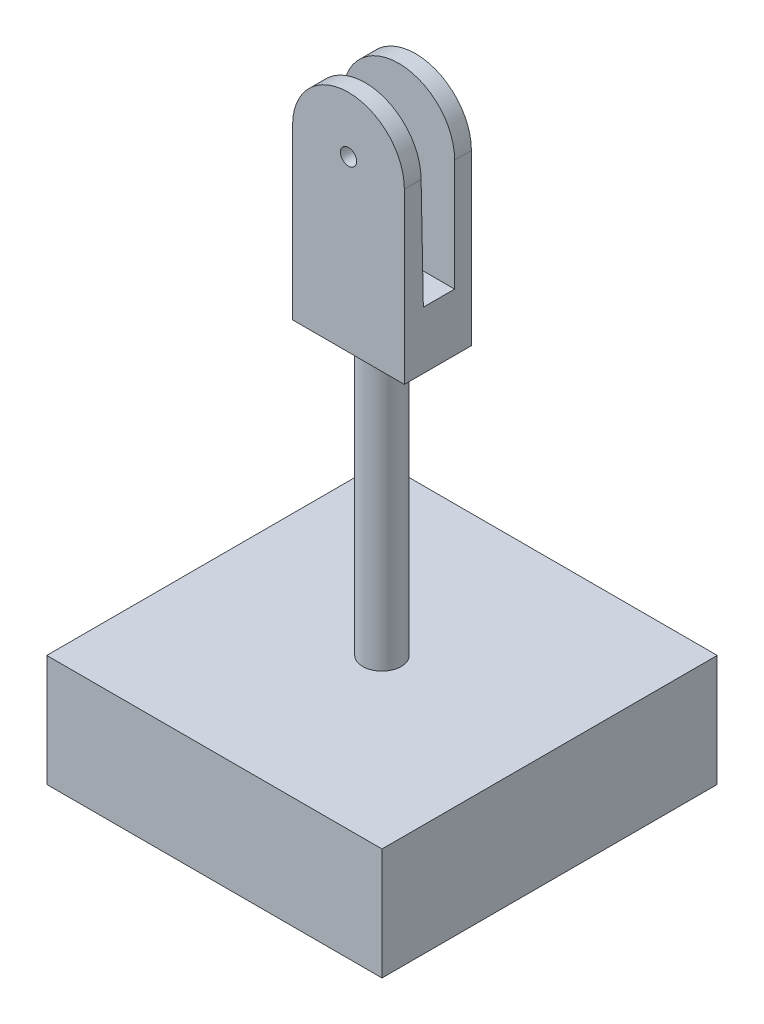
ISO-10303-21;
HEADER;
FILE_DESCRIPTION(('STEP AP214'),'2;1');
FILE_NAME('part.step','',(''),(''),'','','');
FILE_SCHEMA(('AUTOMOTIVE_DESIGN { 1 0 10303 214 1 1 1 1 }'));
ENDSEC;
DATA;
#1=APPLICATION_CONTEXT('core data for automotive mechanical design processes');
#2=APPLICATION_PROTOCOL_DEFINITION('international standard','automotive_design',2000,#1);
#3=PRODUCT_CONTEXT('',#1,'mechanical');
#4=PRODUCT('Part','Part','',(#3));
#5=PRODUCT_RELATED_PRODUCT_CATEGORY('part','',(#4));
#6=PRODUCT_DEFINITION_FORMATION('','',#4);
#7=PRODUCT_DEFINITION_CONTEXT('part definition',#1,'design');
#8=PRODUCT_DEFINITION('design','',#6,#7);
#9=PRODUCT_DEFINITION_SHAPE('','',#8);
#10=(LENGTH_UNIT() NAMED_UNIT(*) SI_UNIT(.MILLI.,.METRE.));
#11=(NAMED_UNIT(*) PLANE_ANGLE_UNIT() SI_UNIT($,.RADIAN.));
#12=(NAMED_UNIT(*) SI_UNIT($,.STERADIAN.) SOLID_ANGLE_UNIT());
#13=UNCERTAINTY_MEASURE_WITH_UNIT(LENGTH_MEASURE(1.E-05),#10,'distance_accuracy_value','');
#14=(GEOMETRIC_REPRESENTATION_CONTEXT(3) GLOBAL_UNCERTAINTY_ASSIGNED_CONTEXT((#13)) GLOBAL_UNIT_ASSIGNED_CONTEXT((#10,
#11,#12)) REPRESENTATION_CONTEXT('',''));
#15=CARTESIAN_POINT('',(0.,0.,0.));
#16=DIRECTION('',(0.,0.,1.));
#17=DIRECTION('',(1.,0.,0.));
#18=AXIS2_PLACEMENT_3D('',#15,#16,#17);
#19=CARTESIAN_POINT('',(0.,-100.276417548068,36.));
#20=DIRECTION('',(0.,0.,-1.));
#21=DIRECTION('',(-1.,0.,0.));
#22=AXIS2_PLACEMENT_3D('',#19,#20,#21);
#23=PLANE('',#22);
#24=DIRECTION('',(-1.,0.,0.));
#25=VECTOR('',#24,1.);
#26=CARTESIAN_POINT('',(0.,-80.2764175480678,36.));
#27=LINE('',#26,#25);
#28=CARTESIAN_POINT('',(30.,-80.2764175480678,36.));
#29=VERTEX_POINT('',#28);
#30=CARTESIAN_POINT('',(-30.,-80.2764175480678,36.));
#31=VERTEX_POINT('',#30);
#32=EDGE_CURVE('E113',#29,#31,#27,.T.);
#33=ORIENTED_EDGE('',*,*,#32,.T.);
#34=DIRECTION('',(0.,1.,0.));
#35=VECTOR('',#34,1.);
#36=CARTESIAN_POINT('',(-30.,-100.276417548068,36.));
#37=LINE('',#36,#35);
#38=CARTESIAN_POINT('',(-30.,-100.276417548068,36.));
#39=VERTEX_POINT('',#38);
#40=EDGE_CURVE('E12',#39,#31,#37,.T.);
#41=ORIENTED_EDGE('',*,*,#40,.F.);
#42=DIRECTION('',(-1.,0.,0.));
#43=VECTOR('',#42,1.);
#44=CARTESIAN_POINT('',(0.,-100.276417548068,36.));
#45=LINE('',#44,#43);
#46=CARTESIAN_POINT('',(30.,-100.276417548068,36.));
#47=VERTEX_POINT('',#46);
#48=EDGE_CURVE('E96',#47,#39,#45,.T.);
#49=ORIENTED_EDGE('',*,*,#48,.F.);
#50=DIRECTION('',(0.,1.,0.));
#51=VECTOR('',#50,1.);
#52=CARTESIAN_POINT('',(30.,-100.276417548068,36.));
#53=LINE('',#52,#51);
#54=EDGE_CURVE('E63',#47,#29,#53,.T.);
#55=ORIENTED_EDGE('',*,*,#54,.T.);
#56=EDGE_LOOP('',(#33,#41,#49,#55));
#57=FACE_BOUND('',#56,.T.);
#58=ADVANCED_FACE('F46',(#57),#23,.F.);
#59=CARTESIAN_POINT('',(-30.,-100.276417548068,0.));
#60=DIRECTION('',(1.,0.,0.));
#61=DIRECTION('',(0.,0.,-1.));
#62=AXIS2_PLACEMENT_3D('',#59,#60,#61);
#63=PLANE('',#62);
#64=DIRECTION('',(0.,0.,-1.));
#65=VECTOR('',#64,1.);
#66=CARTESIAN_POINT('',(-30.,-80.2764175480678,0.));
#67=LINE('',#66,#65);
#68=CARTESIAN_POINT('',(-30.,-80.2764175480678,-24.));
#69=VERTEX_POINT('',#68);
#70=EDGE_CURVE('E101',#31,#69,#67,.T.);
#71=ORIENTED_EDGE('',*,*,#70,.T.);
#72=DIRECTION('',(0.,1.,0.));
#73=VECTOR('',#72,1.);
#74=CARTESIAN_POINT('',(-30.,-100.276417548068,-24.));
#75=LINE('',#74,#73);
#76=CARTESIAN_POINT('',(-30.,-100.276417548068,-24.));
#77=VERTEX_POINT('',#76);
#78=EDGE_CURVE('E55',#77,#69,#75,.T.);
#79=ORIENTED_EDGE('',*,*,#78,.F.);
#80=DIRECTION('',(0.,0.,-1.));
#81=VECTOR('',#80,1.);
#82=CARTESIAN_POINT('',(-30.,-100.276417548068,0.));
#83=LINE('',#82,#81);
#84=EDGE_CURVE('E88',#39,#77,#83,.T.);
#85=ORIENTED_EDGE('',*,*,#84,.F.);
#86=ORIENTED_EDGE('',*,*,#40,.T.);
#87=EDGE_LOOP('',(#71,#79,#85,#86));
#88=FACE_BOUND('',#87,.T.);
#89=ADVANCED_FACE('F100',(#88),#63,.F.);
#90=CARTESIAN_POINT('',(0.,-100.276417548068,-24.));
#91=DIRECTION('',(0.,0.,-1.));
#92=DIRECTION('',(-1.,0.,0.));
#93=AXIS2_PLACEMENT_3D('',#90,#91,#92);
#94=PLANE('',#93);
#95=DIRECTION('',(-1.,0.,0.));
#96=VECTOR('',#95,1.);
#97=CARTESIAN_POINT('',(0.,-80.2764175480678,-24.));
#98=LINE('',#97,#96);
#99=CARTESIAN_POINT('',(30.,-80.2764175480678,-24.));
#100=VERTEX_POINT('',#99);
#101=EDGE_CURVE('E116',#100,#69,#98,.T.);
#102=ORIENTED_EDGE('',*,*,#101,.F.);
#103=DIRECTION('',(0.,1.,0.));
#104=VECTOR('',#103,1.);
#105=CARTESIAN_POINT('',(30.,-100.276417548068,-24.));
#106=LINE('',#105,#104);
#107=CARTESIAN_POINT('',(30.,-100.276417548068,-24.));
#108=VERTEX_POINT('',#107);
#109=EDGE_CURVE('E77',#108,#100,#106,.T.);
#110=ORIENTED_EDGE('',*,*,#109,.F.);
#111=DIRECTION('',(-1.,0.,0.));
#112=VECTOR('',#111,1.);
#113=CARTESIAN_POINT('',(0.,-100.276417548068,-24.));
#114=LINE('',#113,#112);
#115=EDGE_CURVE('E95',#108,#77,#114,.T.);
#116=ORIENTED_EDGE('',*,*,#115,.T.);
#117=ORIENTED_EDGE('',*,*,#78,.T.);
#118=EDGE_LOOP('',(#102,#110,#116,#117));
#119=FACE_BOUND('',#118,.T.);
#120=ADVANCED_FACE('F104',(#119),#94,.T.);
#121=CARTESIAN_POINT('',(0.,-100.276417548068,6.));
#122=DIRECTION('',(0.,1.,0.));
#123=DIRECTION('',(0.,0.,1.));
#124=AXIS2_PLACEMENT_3D('',#121,#122,#123);
#125=CYLINDRICAL_SURFACE('',#124,3.45);
#126=CARTESIAN_POINT('',(0.,-100.276417548068,6.));
#127=DIRECTION('',(0.,-1.,0.));
#128=DIRECTION('',(0.,0.,-1.));
#129=AXIS2_PLACEMENT_3D('',#126,#127,#128);
#130=CIRCLE('',#129,3.45);
#131=CARTESIAN_POINT('',(0.,-100.276417548068,2.55));
#132=VERTEX_POINT('',#131);
#133=EDGE_CURVE('E121',#132,#132,#130,.T.);
#134=ORIENTED_EDGE('',*,*,#133,.T.);
#135=EDGE_LOOP('',(#134));
#136=FACE_BOUND('',#135,.T.);
#137=CARTESIAN_POINT('',(0.,-80.2764175480678,6.));
#138=DIRECTION('',(0.,-1.,0.));
#139=DIRECTION('',(0.,0.,-1.));
#140=AXIS2_PLACEMENT_3D('',#137,#138,#139);
#141=CIRCLE('',#140,3.45);
#142=CARTESIAN_POINT('',(0.,-80.2764175480678,2.55));
#143=VERTEX_POINT('',#142);
#144=EDGE_CURVE('E110',#143,#143,#141,.T.);
#145=ORIENTED_EDGE('',*,*,#144,.F.);
#146=EDGE_LOOP('',(#145));
#147=FACE_BOUND('',#146,.T.);
#148=ADVANCED_FACE('F48',(#136,#147),#125,.F.);
#149=CARTESIAN_POINT('',(30.,-100.276417548068,0.));
#150=DIRECTION('',(1.,0.,0.));
#151=DIRECTION('',(0.,0.,-1.));
#152=AXIS2_PLACEMENT_3D('',#149,#150,#151);
#153=PLANE('',#152);
#154=DIRECTION('',(0.,0.,-1.));
#155=VECTOR('',#154,1.);
#156=CARTESIAN_POINT('',(30.,-80.2764175480678,0.));
#157=LINE('',#156,#155);
#158=EDGE_CURVE('E118',#29,#100,#157,.T.);
#159=ORIENTED_EDGE('',*,*,#158,.F.);
#160=ORIENTED_EDGE('',*,*,#54,.F.);
#161=DIRECTION('',(0.,0.,-1.));
#162=VECTOR('',#161,1.);
#163=CARTESIAN_POINT('',(30.,-100.276417548068,0.));
#164=LINE('',#163,#162);
#165=EDGE_CURVE('E105',#47,#108,#164,.T.);
#166=ORIENTED_EDGE('',*,*,#165,.T.);
#167=ORIENTED_EDGE('',*,*,#109,.T.);
#168=EDGE_LOOP('',(#159,#160,#166,#167));
#169=FACE_BOUND('',#168,.T.);
#170=ADVANCED_FACE('F132',(#169),#153,.T.);
#171=CARTESIAN_POINT('',(0.,-100.276417548068,0.));
#172=DIRECTION('',(0.,-1.,0.));
#173=DIRECTION('',(0.,0.,-1.));
#174=AXIS2_PLACEMENT_3D('',#171,#172,#173);
#175=PLANE('',#174);
#176=ORIENTED_EDGE('',*,*,#133,.F.);
#177=EDGE_LOOP('',(#176));
#178=FACE_BOUND('',#177,.T.);
#179=ORIENTED_EDGE('',*,*,#48,.T.);
#180=ORIENTED_EDGE('',*,*,#84,.T.);
#181=ORIENTED_EDGE('',*,*,#115,.F.);
#182=ORIENTED_EDGE('',*,*,#165,.F.);
#183=EDGE_LOOP('',(#179,#180,#181,#182));
#184=FACE_BOUND('',#183,.T.);
#185=ADVANCED_FACE('F92',(#178,#184),#175,.T.);
#186=CARTESIAN_POINT('',(0.,-80.2764175480678,0.));
#187=DIRECTION('',(0.,-1.,0.));
#188=DIRECTION('',(0.,0.,-1.));
#189=AXIS2_PLACEMENT_3D('',#186,#187,#188);
#190=PLANE('',#189);
#191=ORIENTED_EDGE('',*,*,#144,.T.);
#192=EDGE_LOOP('',(#191));
#193=FACE_BOUND('',#192,.T.);
#194=ORIENTED_EDGE('',*,*,#32,.F.);
#195=ORIENTED_EDGE('',*,*,#158,.T.);
#196=ORIENTED_EDGE('',*,*,#101,.T.);
#197=ORIENTED_EDGE('',*,*,#70,.F.);
#198=EDGE_LOOP('',(#194,#195,#196,#197));
#199=FACE_BOUND('',#198,.T.);
#200=ADVANCED_FACE('F131',(#193,#199),#190,.F.);
#201=CLOSED_SHELL('',(#58,#89,#120,#148,#170,#185,#200));
#202=MANIFOLD_SOLID_BREP('B2',#201);
#203=CARTESIAN_POINT('',(10.,0.,12.));
#204=DIRECTION('',(-1.,0.,0.));
#205=DIRECTION('',(0.,-1.,0.));
#206=AXIS2_PLACEMENT_3D('',#203,#204,#205);
#207=PLANE('',#206);
#208=DIRECTION('',(0.,-1.,0.));
#209=VECTOR('',#208,1.);
#210=CARTESIAN_POINT('',(10.,0.,3.));
#211=LINE('',#210,#209);
#212=CARTESIAN_POINT('',(10.,0.,3.));
#213=VERTEX_POINT('',#212);
#214=CARTESIAN_POINT('',(10.,-20.,3.));
#215=VERTEX_POINT('',#214);
#216=EDGE_CURVE('E354',#213,#215,#211,.T.);
#217=ORIENTED_EDGE('',*,*,#216,.T.);
#218=DIRECTION('',(0.,0.,-1.));
#219=VECTOR('',#218,1.);
#220=CARTESIAN_POINT('',(10.,-20.,0.));
#221=LINE('',#220,#219);
#222=CARTESIAN_POINT('',(10.,-20.,8.60053372982809));
#223=VERTEX_POINT('',#222);
#224=EDGE_CURVE('E393',#223,#215,#221,.T.);
#225=ORIENTED_EDGE('',*,*,#224,.F.);
#226=DIRECTION('',(0.,-0.999800593034313,-0.0199693306907542));
#227=VECTOR('',#226,1.);
#228=CARTESIAN_POINT('',(10.,-0.179688138004029,8.99641103248587));
#229=LINE('',#228,#227);
#230=CARTESIAN_POINT('',(10.,0.,9.));
#231=VERTEX_POINT('',#230);
#232=EDGE_CURVE('E391',#231,#223,#229,.T.);
#233=ORIENTED_EDGE('',*,*,#232,.F.);
#234=DIRECTION('',(0.,0.,-1.));
#235=VECTOR('',#234,1.);
#236=CARTESIAN_POINT('',(10.,0.,12.));
#237=LINE('',#236,#235);
#238=CARTESIAN_POINT('',(10.,0.,12.));
#239=VERTEX_POINT('',#238);
#240=EDGE_CURVE('E288',#239,#231,#237,.T.);
#241=ORIENTED_EDGE('',*,*,#240,.F.);
#242=DIRECTION('',(0.,1.,0.));
#243=VECTOR('',#242,1.);
#244=CARTESIAN_POINT('',(10.,0.,12.));
#245=LINE('',#244,#243);
#246=CARTESIAN_POINT('',(10.,-30.2764175480678,12.));
#247=VERTEX_POINT('',#246);
#248=EDGE_CURVE('E313',#247,#239,#245,.T.);
#249=ORIENTED_EDGE('',*,*,#248,.F.);
#250=DIRECTION('',(0.,0.,-1.));
#251=VECTOR('',#250,1.);
#252=CARTESIAN_POINT('',(10.,-30.2764175480678,12.));
#253=LINE('',#252,#251);
#254=CARTESIAN_POINT('',(10.,-30.2764175480678,0.));
#255=VERTEX_POINT('',#254);
#256=EDGE_CURVE('E328',#247,#255,#253,.T.);
#257=ORIENTED_EDGE('',*,*,#256,.T.);
#258=DIRECTION('',(0.,1.,0.));
#259=VECTOR('',#258,1.);
#260=CARTESIAN_POINT('',(10.,0.,0.));
#261=LINE('',#260,#259);
#262=CARTESIAN_POINT('',(10.,0.,0.));
#263=VERTEX_POINT('',#262);
#264=EDGE_CURVE('E332',#255,#263,#261,.T.);
#265=ORIENTED_EDGE('',*,*,#264,.T.);
#266=EDGE_CURVE('E295',#213,#263,#237,.T.);
#267=ORIENTED_EDGE('',*,*,#266,.F.);
#268=EDGE_LOOP('',(#217,#225,#233,#241,#249,#257,#265,#267));
#269=FACE_BOUND('',#268,.T.);
#270=ADVANCED_FACE('F190',(#269),#207,.F.);
#271=CARTESIAN_POINT('',(0.,0.,12.));
#272=DIRECTION('',(0.,0.,-1.));
#273=DIRECTION('',(-1.,0.,0.));
#274=AXIS2_PLACEMENT_3D('',#271,#272,#273);
#275=CYLINDRICAL_SURFACE('',#274,10.);
#276=CARTESIAN_POINT('',(0.,0.,3.));
#277=DIRECTION('',(0.,0.,1.));
#278=DIRECTION('',(1.,0.,0.));
#279=AXIS2_PLACEMENT_3D('',#276,#277,#278);
#280=CIRCLE('',#279,10.);
#281=CARTESIAN_POINT('',(-10.,0.,3.));
#282=VERTEX_POINT('',#281);
#283=EDGE_CURVE('E322',#213,#282,#280,.T.);
#284=ORIENTED_EDGE('',*,*,#283,.F.);
#285=ORIENTED_EDGE('',*,*,#266,.T.);
#286=CARTESIAN_POINT('',(0.,0.,0.));
#287=DIRECTION('',(0.,0.,1.));
#288=DIRECTION('',(1.,0.,0.));
#289=AXIS2_PLACEMENT_3D('',#286,#287,#288);
#290=CIRCLE('',#289,10.);
#291=CARTESIAN_POINT('',(-10.,0.,0.));
#292=VERTEX_POINT('',#291);
#293=EDGE_CURVE('E335',#263,#292,#290,.T.);
#294=ORIENTED_EDGE('',*,*,#293,.T.);
#295=DIRECTION('',(0.,0.,-1.));
#296=VECTOR('',#295,1.);
#297=CARTESIAN_POINT('',(-10.,0.,12.));
#298=LINE('',#297,#296);
#299=EDGE_CURVE('E296',#282,#292,#298,.T.);
#300=ORIENTED_EDGE('',*,*,#299,.F.);
#301=EDGE_LOOP('',(#284,#285,#294,#300));
#302=FACE_BOUND('',#301,.T.);
#303=ADVANCED_FACE('F357',(#302),#275,.T.);
#304=CARTESIAN_POINT('',(0.,0.,9.));
#305=DIRECTION('',(0.,0.,-1.));
#306=DIRECTION('',(-1.,0.,0.));
#307=AXIS2_PLACEMENT_3D('',#304,#305,#306);
#308=CIRCLE('',#307,10.);
#309=CARTESIAN_POINT('',(-10.,0.,9.));
#310=VERTEX_POINT('',#309);
#311=EDGE_CURVE('E266',#310,#231,#308,.T.);
#312=ORIENTED_EDGE('',*,*,#311,.F.);
#313=CARTESIAN_POINT('',(-10.,0.,12.));
#314=VERTEX_POINT('',#313);
#315=EDGE_CURVE('E285',#314,#310,#298,.T.);
#316=ORIENTED_EDGE('',*,*,#315,.F.);
#317=CARTESIAN_POINT('',(0.,0.,12.));
#318=DIRECTION('',(0.,0.,1.));
#319=DIRECTION('',(1.,0.,0.));
#320=AXIS2_PLACEMENT_3D('',#317,#318,#319);
#321=CIRCLE('',#320,10.);
#322=EDGE_CURVE('E317',#239,#314,#321,.T.);
#323=ORIENTED_EDGE('',*,*,#322,.F.);
#324=ORIENTED_EDGE('',*,*,#240,.T.);
#325=EDGE_LOOP('',(#312,#316,#323,#324));
#326=FACE_BOUND('',#325,.T.);
#327=ADVANCED_FACE('F284',(#326),#275,.T.);
#328=CARTESIAN_POINT('',(-10.,0.,12.));
#329=DIRECTION('',(1.,0.,0.));
#330=DIRECTION('',(0.,1.,0.));
#331=AXIS2_PLACEMENT_3D('',#328,#329,#330);
#332=PLANE('',#331);
#333=DIRECTION('',(0.,-1.,0.));
#334=VECTOR('',#333,1.);
#335=CARTESIAN_POINT('',(-10.,0.,3.));
#336=LINE('',#335,#334);
#337=CARTESIAN_POINT('',(-10.,-20.,3.));
#338=VERTEX_POINT('',#337);
#339=EDGE_CURVE('E279',#282,#338,#336,.T.);
#340=ORIENTED_EDGE('',*,*,#339,.F.);
#341=ORIENTED_EDGE('',*,*,#299,.T.);
#342=DIRECTION('',(0.,-1.,0.));
#343=VECTOR('',#342,1.);
#344=CARTESIAN_POINT('',(-10.,0.,0.));
#345=LINE('',#344,#343);
#346=CARTESIAN_POINT('',(-10.,-30.2764175480678,0.));
#347=VERTEX_POINT('',#346);
#348=EDGE_CURVE('E319',#292,#347,#345,.T.);
#349=ORIENTED_EDGE('',*,*,#348,.T.);
#350=DIRECTION('',(0.,0.,-1.));
#351=VECTOR('',#350,1.);
#352=CARTESIAN_POINT('',(-10.,-30.2764175480678,12.));
#353=LINE('',#352,#351);
#354=CARTESIAN_POINT('',(-10.,-30.2764175480678,12.));
#355=VERTEX_POINT('',#354);
#356=EDGE_CURVE('E299',#355,#347,#353,.T.);
#357=ORIENTED_EDGE('',*,*,#356,.F.);
#358=DIRECTION('',(0.,-1.,0.));
#359=VECTOR('',#358,1.);
#360=CARTESIAN_POINT('',(-10.,0.,12.));
#361=LINE('',#360,#359);
#362=EDGE_CURVE('E294',#314,#355,#361,.T.);
#363=ORIENTED_EDGE('',*,*,#362,.F.);
#364=ORIENTED_EDGE('',*,*,#315,.T.);
#365=DIRECTION('',(0.,-0.999800593034313,-0.0199693306907542));
#366=VECTOR('',#365,1.);
#367=CARTESIAN_POINT('',(-10.,-0.179688138004029,8.99641103248587));
#368=LINE('',#367,#366);
#369=CARTESIAN_POINT('',(-10.,-20.,8.60053372982809));
#370=VERTEX_POINT('',#369);
#371=EDGE_CURVE('E274',#310,#370,#368,.T.);
#372=ORIENTED_EDGE('',*,*,#371,.T.);
#373=DIRECTION('',(0.,0.,-1.));
#374=VECTOR('',#373,1.);
#375=CARTESIAN_POINT('',(-10.,-20.,0.));
#376=LINE('',#375,#374);
#377=EDGE_CURVE('E207',#370,#338,#376,.T.);
#378=ORIENTED_EDGE('',*,*,#377,.T.);
#379=EDGE_LOOP('',(#340,#341,#349,#357,#363,#364,#372,#378));
#380=FACE_BOUND('',#379,.T.);
#381=ADVANCED_FACE('F292',(#380),#332,.F.);
#382=CARTESIAN_POINT('',(0.,0.,12.));
#383=DIRECTION('',(0.,0.,-1.));
#384=DIRECTION('',(-1.,0.,0.));
#385=AXIS2_PLACEMENT_3D('',#382,#383,#384);
#386=CYLINDRICAL_SURFACE('',#385,1.45);
#387=CARTESIAN_POINT('',(0.,0.,0.));
#388=DIRECTION('',(0.,0.,1.));
#389=DIRECTION('',(1.,0.,0.));
#390=AXIS2_PLACEMENT_3D('',#387,#388,#389);
#391=CIRCLE('',#390,1.45);
#392=CARTESIAN_POINT('',(1.45,0.,0.));
#393=VERTEX_POINT('',#392);
#394=EDGE_CURVE('E329',#393,#393,#391,.T.);
#395=ORIENTED_EDGE('',*,*,#394,.F.);
#396=EDGE_LOOP('',(#395));
#397=FACE_BOUND('',#396,.T.);
#398=CARTESIAN_POINT('',(0.,0.,3.));
#399=DIRECTION('',(0.,0.,1.));
#400=DIRECTION('',(1.,0.,0.));
#401=AXIS2_PLACEMENT_3D('',#398,#399,#400);
#402=CIRCLE('',#401,1.45);
#403=CARTESIAN_POINT('',(1.45,0.,3.));
#404=VERTEX_POINT('',#403);
#405=EDGE_CURVE('E194',#404,#404,#402,.T.);
#406=ORIENTED_EDGE('',*,*,#405,.T.);
#407=EDGE_LOOP('',(#406));
#408=FACE_BOUND('',#407,.T.);
#409=ADVANCED_FACE('F308',(#397,#408),#386,.F.);
#410=CARTESIAN_POINT('',(0.,0.,9.));
#411=DIRECTION('',(0.,-0.0199693306907542,0.999800593034313));
#412=DIRECTION('',(0.,-0.999800593034313,-0.0199693306907542));
#413=AXIS2_PLACEMENT_3D('',#410,#411,#412);
#414=ELLIPSE('',#413,1.4502891977683,1.45);
#415=CARTESIAN_POINT('',(-1.45,0.,9.));
#416=VERTEX_POINT('',#415);
#417=CARTESIAN_POINT('',(1.45,0.,9.));
#418=VERTEX_POINT('',#417);
#419=EDGE_CURVE('E199',#416,#418,#414,.T.);
#420=ORIENTED_EDGE('',*,*,#419,.F.);
#421=CARTESIAN_POINT('',(0.,0.,9.));
#422=DIRECTION('',(0.,0.,-1.));
#423=DIRECTION('',(-1.,0.,0.));
#424=AXIS2_PLACEMENT_3D('',#421,#422,#423);
#425=CIRCLE('',#424,1.45);
#426=EDGE_CURVE('E268',#416,#418,#425,.T.);
#427=ORIENTED_EDGE('',*,*,#426,.T.);
#428=EDGE_LOOP('',(#420,#427));
#429=FACE_BOUND('',#428,.T.);
#430=CARTESIAN_POINT('',(0.,0.,12.));
#431=DIRECTION('',(0.,0.,1.));
#432=DIRECTION('',(1.,0.,0.));
#433=AXIS2_PLACEMENT_3D('',#430,#431,#432);
#434=CIRCLE('',#433,1.45);
#435=CARTESIAN_POINT('',(1.45,0.,12.));
#436=VERTEX_POINT('',#435);
#437=EDGE_CURVE('E311',#436,#436,#434,.T.);
#438=ORIENTED_EDGE('',*,*,#437,.T.);
#439=EDGE_LOOP('',(#438));
#440=FACE_BOUND('',#439,.T.);
#441=ADVANCED_FACE('F192',(#429,#440),#386,.F.);
#442=CARTESIAN_POINT('',(0.,-30.2764175480678,12.));
#443=DIRECTION('',(0.,1.,0.));
#444=DIRECTION('',(0.,0.,1.));
#445=AXIS2_PLACEMENT_3D('',#442,#443,#444);
#446=PLANE('',#445);
#447=CARTESIAN_POINT('',(0.,-30.2764175480678,6.));
#448=DIRECTION('',(0.,-1.,0.));
#449=DIRECTION('',(0.,0.,-1.));
#450=AXIS2_PLACEMENT_3D('',#447,#448,#449);
#451=CIRCLE('',#450,3.45);
#452=CARTESIAN_POINT('',(0.,-30.2764175480678,2.55));
#453=VERTEX_POINT('',#452);
#454=EDGE_CURVE('E44',#453,#453,#451,.T.);
#455=ORIENTED_EDGE('',*,*,#454,.F.);
#456=EDGE_LOOP('',(#455));
#457=FACE_BOUND('',#456,.T.);
#458=DIRECTION('',(1.,0.,0.));
#459=VECTOR('',#458,1.);
#460=CARTESIAN_POINT('',(0.,-30.2764175480678,0.));
#461=LINE('',#460,#459);
#462=EDGE_CURVE('E314',#347,#255,#461,.T.);
#463=ORIENTED_EDGE('',*,*,#462,.T.);
#464=ORIENTED_EDGE('',*,*,#256,.F.);
#465=DIRECTION('',(1.,0.,0.));
#466=VECTOR('',#465,1.);
#467=CARTESIAN_POINT('',(0.,-30.2764175480678,12.));
#468=LINE('',#467,#466);
#469=EDGE_CURVE('E326',#355,#247,#468,.T.);
#470=ORIENTED_EDGE('',*,*,#469,.F.);
#471=ORIENTED_EDGE('',*,*,#356,.T.);
#472=EDGE_LOOP('',(#463,#464,#470,#471));
#473=FACE_BOUND('',#472,.T.);
#474=ADVANCED_FACE('F307',(#457,#473),#446,.F.);
#475=CARTESIAN_POINT('',(0.,0.,12.));
#476=DIRECTION('',(0.,0.,1.));
#477=DIRECTION('',(1.,0.,0.));
#478=AXIS2_PLACEMENT_3D('',#475,#476,#477);
#479=PLANE('',#478);
#480=ORIENTED_EDGE('',*,*,#437,.F.);
#481=EDGE_LOOP('',(#480));
#482=FACE_BOUND('',#481,.T.);
#483=ORIENTED_EDGE('',*,*,#248,.T.);
#484=ORIENTED_EDGE('',*,*,#322,.T.);
#485=ORIENTED_EDGE('',*,*,#362,.T.);
#486=ORIENTED_EDGE('',*,*,#469,.T.);
#487=EDGE_LOOP('',(#483,#484,#485,#486));
#488=FACE_BOUND('',#487,.T.);
#489=ADVANCED_FACE('F373',(#482,#488),#479,.T.);
#490=CARTESIAN_POINT('',(0.,0.,0.));
#491=DIRECTION('',(0.,0.,1.));
#492=DIRECTION('',(1.,0.,0.));
#493=AXIS2_PLACEMENT_3D('',#490,#491,#492);
#494=PLANE('',#493);
#495=ORIENTED_EDGE('',*,*,#394,.T.);
#496=EDGE_LOOP('',(#495));
#497=FACE_BOUND('',#496,.T.);
#498=ORIENTED_EDGE('',*,*,#264,.F.);
#499=ORIENTED_EDGE('',*,*,#462,.F.);
#500=ORIENTED_EDGE('',*,*,#348,.F.);
#501=ORIENTED_EDGE('',*,*,#293,.F.);
#502=EDGE_LOOP('',(#498,#499,#500,#501));
#503=FACE_BOUND('',#502,.T.);
#504=ADVANCED_FACE('F349',(#497,#503),#494,.F.);
#505=CARTESIAN_POINT('',(-10.,0.,3.));
#506=DIRECTION('',(0.,0.,1.));
#507=DIRECTION('',(1.,0.,0.));
#508=AXIS2_PLACEMENT_3D('',#505,#506,#507);
#509=PLANE('',#508);
#510=ORIENTED_EDGE('',*,*,#405,.F.);
#511=EDGE_LOOP('',(#510));
#512=FACE_BOUND('',#511,.T.);
#513=ORIENTED_EDGE('',*,*,#283,.T.);
#514=ORIENTED_EDGE('',*,*,#339,.T.);
#515=DIRECTION('',(1.,0.,0.));
#516=VECTOR('',#515,1.);
#517=CARTESIAN_POINT('',(-10.,-20.,3.));
#518=LINE('',#517,#516);
#519=EDGE_CURVE('E289',#338,#215,#518,.T.);
#520=ORIENTED_EDGE('',*,*,#519,.T.);
#521=ORIENTED_EDGE('',*,*,#216,.F.);
#522=EDGE_LOOP('',(#513,#514,#520,#521));
#523=FACE_BOUND('',#522,.T.);
#524=ADVANCED_FACE('F364',(#512,#523),#509,.T.);
#525=CARTESIAN_POINT('',(-10.,0.,9.));
#526=DIRECTION('',(0.,0.,-1.));
#527=DIRECTION('',(-1.,0.,0.));
#528=AXIS2_PLACEMENT_3D('',#525,#526,#527);
#529=PLANE('',#528);
#530=ORIENTED_EDGE('',*,*,#311,.T.);
#531=DIRECTION('',(1.,0.,0.));
#532=VECTOR('',#531,1.);
#533=CARTESIAN_POINT('',(-10.,0.,9.));
#534=LINE('',#533,#532);
#535=EDGE_CURVE('E215',#418,#231,#534,.T.);
#536=ORIENTED_EDGE('',*,*,#535,.F.);
#537=ORIENTED_EDGE('',*,*,#426,.F.);
#538=EDGE_CURVE('E262',#310,#416,#534,.T.);
#539=ORIENTED_EDGE('',*,*,#538,.F.);
#540=EDGE_LOOP('',(#530,#536,#537,#539));
#541=FACE_BOUND('',#540,.T.);
#542=ADVANCED_FACE('F264',(#541),#529,.T.);
#543=CARTESIAN_POINT('',(-10.,-20.,0.));
#544=DIRECTION('',(0.,-1.,0.));
#545=DIRECTION('',(0.,0.,-1.));
#546=AXIS2_PLACEMENT_3D('',#543,#544,#545);
#547=PLANE('',#546);
#548=ORIENTED_EDGE('',*,*,#224,.T.);
#549=ORIENTED_EDGE('',*,*,#519,.F.);
#550=ORIENTED_EDGE('',*,*,#377,.F.);
#551=DIRECTION('',(1.,0.,0.));
#552=VECTOR('',#551,1.);
#553=CARTESIAN_POINT('',(-10.,-20.,8.60053372982809));
#554=LINE('',#553,#552);
#555=EDGE_CURVE('E271',#370,#223,#554,.T.);
#556=ORIENTED_EDGE('',*,*,#555,.T.);
#557=EDGE_LOOP('',(#548,#549,#550,#556));
#558=FACE_BOUND('',#557,.T.);
#559=ADVANCED_FACE('F371',(#558),#547,.F.);
#560=CARTESIAN_POINT('',(-10.,-0.179688138004029,8.99641103248587));
#561=DIRECTION('',(0.,-0.0199693306907542,0.999800593034313));
#562=DIRECTION('',(0.,-0.999800593034313,-0.0199693306907542));
#563=AXIS2_PLACEMENT_3D('',#560,#561,#562);
#564=PLANE('',#563);
#565=ORIENTED_EDGE('',*,*,#419,.T.);
#566=ORIENTED_EDGE('',*,*,#535,.T.);
#567=ORIENTED_EDGE('',*,*,#232,.T.);
#568=ORIENTED_EDGE('',*,*,#555,.F.);
#569=ORIENTED_EDGE('',*,*,#371,.F.);
#570=ORIENTED_EDGE('',*,*,#538,.T.);
#571=EDGE_LOOP('',(#565,#566,#567,#568,#569,#570));
#572=FACE_BOUND('',#571,.T.);
#573=ADVANCED_FACE('F275',(#572),#564,.F.);
#574=CARTESIAN_POINT('',(0.,-80.2764175480678,6.));
#575=DIRECTION('',(0.,1.,0.));
#576=DIRECTION('',(0.,0.,1.));
#577=AXIS2_PLACEMENT_3D('',#574,#575,#576);
#578=CYLINDRICAL_SURFACE('',#577,3.45);
#579=CARTESIAN_POINT('',(0.,-80.2764175480678,6.));
#580=DIRECTION('',(0.,-1.,0.));
#581=DIRECTION('',(0.,0.,-1.));
#582=AXIS2_PLACEMENT_3D('',#579,#580,#581);
#583=CIRCLE('',#582,3.45);
#584=CARTESIAN_POINT('',(0.,-80.2764175480678,2.55));
#585=VERTEX_POINT('',#584);
#586=EDGE_CURVE('E396',#585,#585,#583,.T.);
#587=ORIENTED_EDGE('',*,*,#586,.F.);
#588=EDGE_LOOP('',(#587));
#589=FACE_BOUND('',#588,.T.);
#590=ORIENTED_EDGE('',*,*,#454,.T.);
#591=EDGE_LOOP('',(#590));
#592=FACE_BOUND('',#591,.T.);
#593=ADVANCED_FACE('F408',(#589,#592),#578,.T.);
#594=CARTESIAN_POINT('',(0.,-80.2764175480678,0.));
#595=DIRECTION('',(0.,-1.,0.));
#596=DIRECTION('',(0.,0.,-1.));
#597=AXIS2_PLACEMENT_3D('',#594,#595,#596);
#598=PLANE('',#597);
#599=ORIENTED_EDGE('',*,*,#586,.T.);
#600=EDGE_LOOP('',(#599));
#601=FACE_BOUND('',#600,.T.);
#602=ADVANCED_FACE('F406',(#601),#598,.T.);
#603=CLOSED_SHELL('',(#270,#303,#327,#381,#409,#441,#474,#489,#504,#524,#542,#559,#573,#593,#602));
#604=MANIFOLD_SOLID_BREP('B6',#603);
#605=ADVANCED_BREP_SHAPE_REPRESENTATION('',(#18,#202,#604),#14);
#606=SHAPE_DEFINITION_REPRESENTATION(#9,#605);
ENDSEC;
END-ISO-10303-21;
